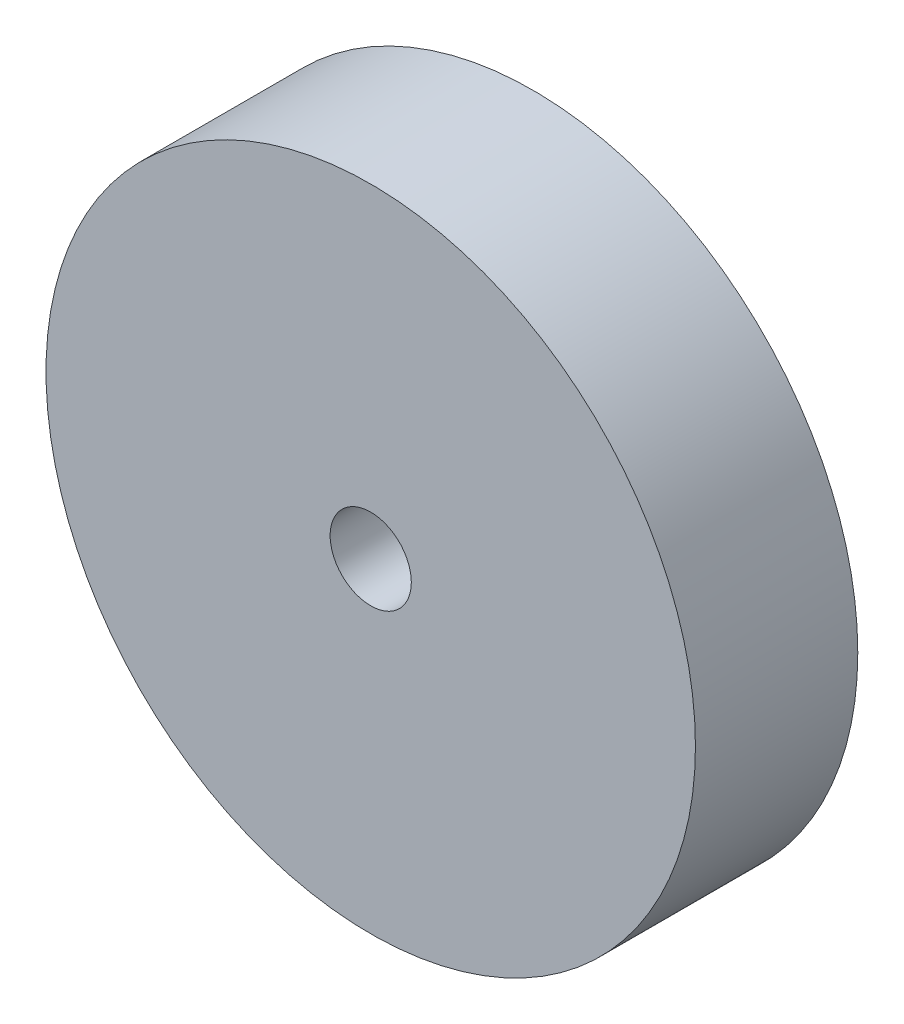
ISO-10303-21;
HEADER;
FILE_DESCRIPTION(('STEP AP214'),'2;1');
FILE_NAME('part.step','',(''),(''),'','','');
FILE_SCHEMA(('AUTOMOTIVE_DESIGN { 1 0 10303 214 1 1 1 1 }'));
ENDSEC;
DATA;
#1=APPLICATION_CONTEXT('core data for automotive mechanical design processes');
#2=APPLICATION_PROTOCOL_DEFINITION('international standard','automotive_design',2000,#1);
#3=PRODUCT_CONTEXT('',#1,'mechanical');
#4=PRODUCT('Part','Part','',(#3));
#5=PRODUCT_RELATED_PRODUCT_CATEGORY('part','',(#4));
#6=PRODUCT_DEFINITION_FORMATION('','',#4);
#7=PRODUCT_DEFINITION_CONTEXT('part definition',#1,'design');
#8=PRODUCT_DEFINITION('design','',#6,#7);
#9=PRODUCT_DEFINITION_SHAPE('','',#8);
#10=(LENGTH_UNIT() NAMED_UNIT(*) SI_UNIT(.MILLI.,.METRE.));
#11=(NAMED_UNIT(*) PLANE_ANGLE_UNIT() SI_UNIT($,.RADIAN.));
#12=(NAMED_UNIT(*) SI_UNIT($,.STERADIAN.) SOLID_ANGLE_UNIT());
#13=UNCERTAINTY_MEASURE_WITH_UNIT(LENGTH_MEASURE(1.E-05),#10,'distance_accuracy_value','');
#14=(GEOMETRIC_REPRESENTATION_CONTEXT(3) GLOBAL_UNCERTAINTY_ASSIGNED_CONTEXT((#13)) GLOBAL_UNIT_ASSIGNED_CONTEXT((#10,
#11,#12)) REPRESENTATION_CONTEXT('',''));
#15=CARTESIAN_POINT('',(0.,0.,0.));
#16=DIRECTION('',(0.,0.,1.));
#17=DIRECTION('',(1.,0.,0.));
#18=AXIS2_PLACEMENT_3D('',#15,#16,#17);
#19=CARTESIAN_POINT('',(0.,0.,10.));
#20=DIRECTION('',(0.,0.,1.));
#21=DIRECTION('',(1.,0.,0.));
#22=AXIS2_PLACEMENT_3D('',#19,#20,#21);
#23=PLANE('',#22);
#24=CARTESIAN_POINT('',(0.,0.,10.));
#25=DIRECTION('',(0.,0.,1.));
#26=DIRECTION('',(1.,0.,0.));
#27=AXIS2_PLACEMENT_3D('',#24,#25,#26);
#28=CIRCLE('',#27,20.);
#29=CARTESIAN_POINT('',(20.,0.,10.));
#30=VERTEX_POINT('',#29);
#31=EDGE_CURVE('E10',#30,#30,#28,.T.);
#32=ORIENTED_EDGE('',*,*,#31,.T.);
#33=EDGE_LOOP('',(#32));
#34=FACE_BOUND('',#33,.T.);
#35=CARTESIAN_POINT('',(0.,0.,10.));
#36=DIRECTION('',(0.,0.,1.));
#37=DIRECTION('',(1.,0.,0.));
#38=AXIS2_PLACEMENT_3D('',#35,#36,#37);
#39=CIRCLE('',#38,2.5);
#40=CARTESIAN_POINT('',(2.5,0.,10.));
#41=VERTEX_POINT('',#40);
#42=EDGE_CURVE('E42',#41,#41,#39,.T.);
#43=ORIENTED_EDGE('',*,*,#42,.F.);
#44=EDGE_LOOP('',(#43));
#45=FACE_BOUND('',#44,.T.);
#46=ADVANCED_FACE('F31',(#34,#45),#23,.T.);
#47=CARTESIAN_POINT('',(0.,0.,0.));
#48=DIRECTION('',(0.,0.,1.));
#49=DIRECTION('',(1.,0.,0.));
#50=AXIS2_PLACEMENT_3D('',#47,#48,#49);
#51=PLANE('',#50);
#52=CARTESIAN_POINT('',(0.,0.,0.));
#53=DIRECTION('',(0.,0.,1.));
#54=DIRECTION('',(1.,0.,0.));
#55=AXIS2_PLACEMENT_3D('',#52,#53,#54);
#56=CIRCLE('',#55,20.);
#57=CARTESIAN_POINT('',(20.,0.,0.));
#58=VERTEX_POINT('',#57);
#59=EDGE_CURVE('E35',#58,#58,#56,.T.);
#60=ORIENTED_EDGE('',*,*,#59,.F.);
#61=EDGE_LOOP('',(#60));
#62=FACE_BOUND('',#61,.T.);
#63=CARTESIAN_POINT('',(0.,0.,0.));
#64=DIRECTION('',(0.,0.,1.));
#65=DIRECTION('',(1.,0.,0.));
#66=AXIS2_PLACEMENT_3D('',#63,#64,#65);
#67=CIRCLE('',#66,2.5);
#68=CARTESIAN_POINT('',(2.5,0.,0.));
#69=VERTEX_POINT('',#68);
#70=EDGE_CURVE('E44',#69,#69,#67,.T.);
#71=ORIENTED_EDGE('',*,*,#70,.T.);
#72=EDGE_LOOP('',(#71));
#73=FACE_BOUND('',#72,.T.);
#74=ADVANCED_FACE('F54',(#62,#73),#51,.F.);
#75=CARTESIAN_POINT('',(0.,0.,10.));
#76=DIRECTION('',(0.,0.,-1.));
#77=DIRECTION('',(-1.,0.,0.));
#78=AXIS2_PLACEMENT_3D('',#75,#76,#77);
#79=CYLINDRICAL_SURFACE('',#78,20.);
#80=ORIENTED_EDGE('',*,*,#31,.F.);
#81=EDGE_LOOP('',(#80));
#82=FACE_BOUND('',#81,.T.);
#83=ORIENTED_EDGE('',*,*,#59,.T.);
#84=EDGE_LOOP('',(#83));
#85=FACE_BOUND('',#84,.T.);
#86=ADVANCED_FACE('F33',(#82,#85),#79,.T.);
#87=CARTESIAN_POINT('',(0.,0.,10.));
#88=DIRECTION('',(0.,0.,-1.));
#89=DIRECTION('',(-1.,0.,0.));
#90=AXIS2_PLACEMENT_3D('',#87,#88,#89);
#91=CYLINDRICAL_SURFACE('',#90,2.5);
#92=ORIENTED_EDGE('',*,*,#42,.T.);
#93=EDGE_LOOP('',(#92));
#94=FACE_BOUND('',#93,.T.);
#95=ORIENTED_EDGE('',*,*,#70,.F.);
#96=EDGE_LOOP('',(#95));
#97=FACE_BOUND('',#96,.T.);
#98=ADVANCED_FACE('F50',(#94,#97),#91,.F.);
#99=CLOSED_SHELL('',(#46,#74,#86,#98));
#100=MANIFOLD_SOLID_BREP('B2',#99);
#101=ADVANCED_BREP_SHAPE_REPRESENTATION('',(#18,#100),#14);
#102=SHAPE_DEFINITION_REPRESENTATION(#9,#101);
ENDSEC;
END-ISO-10303-21;
